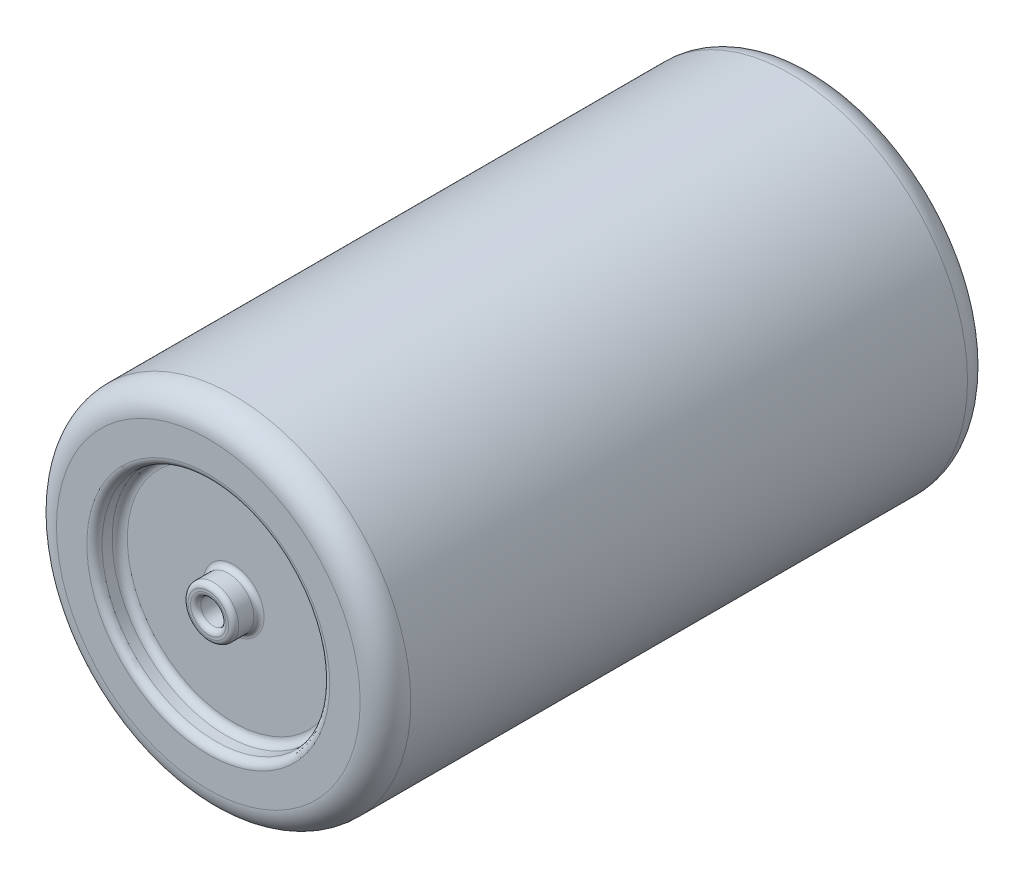
ISO-10303-21;
HEADER;
FILE_DESCRIPTION(('STEP AP214'),'2;1');
FILE_NAME('part.step','',(''),(''),'','','');
FILE_SCHEMA(('AUTOMOTIVE_DESIGN { 1 0 10303 214 1 1 1 1 }'));
ENDSEC;
DATA;
#1=APPLICATION_CONTEXT('core data for automotive mechanical design processes');
#2=APPLICATION_PROTOCOL_DEFINITION('international standard','automotive_design',2000,#1);
#3=PRODUCT_CONTEXT('',#1,'mechanical');
#4=PRODUCT('Part','Part','',(#3));
#5=PRODUCT_RELATED_PRODUCT_CATEGORY('part','',(#4));
#6=PRODUCT_DEFINITION_FORMATION('','',#4);
#7=PRODUCT_DEFINITION_CONTEXT('part definition',#1,'design');
#8=PRODUCT_DEFINITION('design','',#6,#7);
#9=PRODUCT_DEFINITION_SHAPE('','',#8);
#10=(LENGTH_UNIT() NAMED_UNIT(*) SI_UNIT(.MILLI.,.METRE.));
#11=(NAMED_UNIT(*) PLANE_ANGLE_UNIT() SI_UNIT($,.RADIAN.));
#12=(NAMED_UNIT(*) SI_UNIT($,.STERADIAN.) SOLID_ANGLE_UNIT());
#13=UNCERTAINTY_MEASURE_WITH_UNIT(LENGTH_MEASURE(1.E-05),#10,'distance_accuracy_value','');
#14=(GEOMETRIC_REPRESENTATION_CONTEXT(3) GLOBAL_UNCERTAINTY_ASSIGNED_CONTEXT((#13)) GLOBAL_UNIT_ASSIGNED_CONTEXT((#10,
#11,#12)) REPRESENTATION_CONTEXT('',''));
#15=CARTESIAN_POINT('',(0.,0.,0.));
#16=DIRECTION('',(0.,0.,1.));
#17=DIRECTION('',(1.,0.,0.));
#18=AXIS2_PLACEMENT_3D('',#15,#16,#17);
#19=CARTESIAN_POINT('',(0.,0.,6.));
#20=DIRECTION('',(0.,0.,-1.));
#21=DIRECTION('',(-1.,0.,0.));
#22=AXIS2_PLACEMENT_3D('',#19,#20,#21);
#23=CYLINDRICAL_SURFACE('',#22,3.5);
#24=CARTESIAN_POINT('',(0.,0.,-5.5));
#25=DIRECTION('',(0.,0.,1.));
#26=DIRECTION('',(1.,0.,0.));
#27=AXIS2_PLACEMENT_3D('',#24,#25,#26);
#28=CIRCLE('',#27,3.5);
#29=CARTESIAN_POINT('',(3.5,0.,-5.5));
#30=VERTEX_POINT('',#29);
#31=EDGE_CURVE('E121',#30,#30,#28,.T.);
#32=ORIENTED_EDGE('',*,*,#31,.T.);
#33=EDGE_LOOP('',(#32));
#34=FACE_BOUND('',#33,.T.);
#35=CARTESIAN_POINT('',(0.,0.,5.5));
#36=DIRECTION('',(0.,0.,1.));
#37=DIRECTION('',(1.,0.,0.));
#38=AXIS2_PLACEMENT_3D('',#35,#36,#37);
#39=CIRCLE('',#38,3.5);
#40=CARTESIAN_POINT('',(3.5,0.,5.5));
#41=VERTEX_POINT('',#40);
#42=EDGE_CURVE('E124',#41,#41,#39,.F.);
#43=ORIENTED_EDGE('',*,*,#42,.T.);
#44=EDGE_LOOP('',(#43));
#45=FACE_BOUND('',#44,.T.);
#46=ADVANCED_FACE('F35',(#34,#45),#23,.T.);
#47=CARTESIAN_POINT('',(0.,0.,6.));
#48=DIRECTION('',(0.,0.,1.));
#49=DIRECTION('',(1.,0.,0.));
#50=AXIS2_PLACEMENT_3D('',#47,#48,#49);
#51=PLANE('',#50);
#52=CARTESIAN_POINT('',(0.,0.,6.));
#53=DIRECTION('',(0.,0.,1.));
#54=DIRECTION('',(1.,0.,0.));
#55=AXIS2_PLACEMENT_3D('',#52,#53,#54);
#56=CIRCLE('',#55,2.4);
#57=CARTESIAN_POINT('',(2.4,0.,6.));
#58=VERTEX_POINT('',#57);
#59=EDGE_CURVE('E109',#58,#58,#56,.F.);
#60=ORIENTED_EDGE('',*,*,#59,.T.);
#61=EDGE_LOOP('',(#60));
#62=FACE_BOUND('',#61,.T.);
#63=CARTESIAN_POINT('',(0.,0.,6.));
#64=DIRECTION('',(0.,0.,1.));
#65=DIRECTION('',(1.,0.,0.));
#66=AXIS2_PLACEMENT_3D('',#63,#64,#65);
#67=CIRCLE('',#66,3.);
#68=CARTESIAN_POINT('',(3.,0.,6.));
#69=VERTEX_POINT('',#68);
#70=EDGE_CURVE('E115',#69,#69,#67,.T.);
#71=ORIENTED_EDGE('',*,*,#70,.T.);
#72=EDGE_LOOP('',(#71));
#73=FACE_BOUND('',#72,.T.);
#74=ADVANCED_FACE('F137',(#62,#73),#51,.T.);
#75=CARTESIAN_POINT('',(0.,0.,-6.));
#76=DIRECTION('',(0.,0.,1.));
#77=DIRECTION('',(1.,0.,0.));
#78=AXIS2_PLACEMENT_3D('',#75,#76,#77);
#79=PLANE('',#78);
#80=CARTESIAN_POINT('',(0.,0.,-6.));
#81=DIRECTION('',(0.,0.,1.));
#82=DIRECTION('',(1.,0.,0.));
#83=AXIS2_PLACEMENT_3D('',#80,#81,#82);
#84=CIRCLE('',#83,2.4);
#85=CARTESIAN_POINT('',(2.4,0.,-6.));
#86=VERTEX_POINT('',#85);
#87=EDGE_CURVE('E42',#86,#86,#84,.T.);
#88=ORIENTED_EDGE('',*,*,#87,.T.);
#89=EDGE_LOOP('',(#88));
#90=FACE_BOUND('',#89,.T.);
#91=CARTESIAN_POINT('',(0.,0.,-6.));
#92=DIRECTION('',(0.,0.,1.));
#93=DIRECTION('',(1.,0.,0.));
#94=AXIS2_PLACEMENT_3D('',#91,#92,#93);
#95=CIRCLE('',#94,3.);
#96=CARTESIAN_POINT('',(3.,0.,-6.));
#97=VERTEX_POINT('',#96);
#98=EDGE_CURVE('E118',#97,#97,#95,.F.);
#99=ORIENTED_EDGE('',*,*,#98,.T.);
#100=EDGE_LOOP('',(#99));
#101=FACE_BOUND('',#100,.T.);
#102=ADVANCED_FACE('F139',(#90,#101),#79,.F.);
#103=CARTESIAN_POINT('',(0.,0.,-5.5));
#104=DIRECTION('',(0.,0.,1.));
#105=DIRECTION('',(1.,0.,0.));
#106=AXIS2_PLACEMENT_3D('',#103,#104,#105);
#107=TOROIDAL_SURFACE('',#106,3.,0.5);
#108=ORIENTED_EDGE('',*,*,#98,.F.);
#109=EDGE_LOOP('',(#108));
#110=FACE_BOUND('',#109,.T.);
#111=ORIENTED_EDGE('',*,*,#31,.F.);
#112=EDGE_LOOP('',(#111));
#113=FACE_BOUND('',#112,.T.);
#114=ADVANCED_FACE('F133',(#110,#113),#107,.T.);
#115=CARTESIAN_POINT('',(0.,0.,5.5));
#116=DIRECTION('',(0.,0.,1.));
#117=DIRECTION('',(1.,0.,0.));
#118=AXIS2_PLACEMENT_3D('',#115,#116,#117);
#119=TOROIDAL_SURFACE('',#118,3.,0.5);
#120=ORIENTED_EDGE('',*,*,#42,.F.);
#121=EDGE_LOOP('',(#120));
#122=FACE_BOUND('',#121,.T.);
#123=ORIENTED_EDGE('',*,*,#70,.F.);
#124=EDGE_LOOP('',(#123));
#125=FACE_BOUND('',#124,.T.);
#126=ADVANCED_FACE('F129',(#122,#125),#119,.T.);
#127=CARTESIAN_POINT('',(0.,0.,5.5));
#128=DIRECTION('',(0.,0.,1.));
#129=DIRECTION('',(1.,0.,0.));
#130=AXIS2_PLACEMENT_3D('',#127,#128,#129);
#131=CYLINDRICAL_SURFACE('',#130,2.25);
#132=CARTESIAN_POINT('',(0.,0.,5.65));
#133=DIRECTION('',(0.,0.,1.));
#134=DIRECTION('',(1.,0.,0.));
#135=AXIS2_PLACEMENT_3D('',#132,#133,#134);
#136=CIRCLE('',#135,2.25);
#137=CARTESIAN_POINT('',(2.25,0.,5.65));
#138=VERTEX_POINT('',#137);
#139=EDGE_CURVE('E103',#138,#138,#136,.F.);
#140=ORIENTED_EDGE('',*,*,#139,.T.);
#141=EDGE_LOOP('',(#140));
#142=FACE_BOUND('',#141,.T.);
#143=CARTESIAN_POINT('',(0.,0.,5.85));
#144=DIRECTION('',(0.,0.,1.));
#145=DIRECTION('',(1.,0.,0.));
#146=AXIS2_PLACEMENT_3D('',#143,#144,#145);
#147=CIRCLE('',#146,2.25);
#148=CARTESIAN_POINT('',(2.25,0.,5.85));
#149=VERTEX_POINT('',#148);
#150=EDGE_CURVE('E112',#149,#149,#147,.T.);
#151=ORIENTED_EDGE('',*,*,#150,.T.);
#152=EDGE_LOOP('',(#151));
#153=FACE_BOUND('',#152,.T.);
#154=ADVANCED_FACE('F132',(#142,#153),#131,.F.);
#155=CARTESIAN_POINT('',(0.,0.,5.85));
#156=DIRECTION('',(0.,0.,1.));
#157=DIRECTION('',(1.,0.,0.));
#158=AXIS2_PLACEMENT_3D('',#155,#156,#157);
#159=TOROIDAL_SURFACE('',#158,2.4,0.15);
#160=ORIENTED_EDGE('',*,*,#59,.F.);
#161=EDGE_LOOP('',(#160));
#162=FACE_BOUND('',#161,.T.);
#163=ORIENTED_EDGE('',*,*,#150,.F.);
#164=EDGE_LOOP('',(#163));
#165=FACE_BOUND('',#164,.T.);
#166=ADVANCED_FACE('F155',(#162,#165),#159,.T.);
#167=CARTESIAN_POINT('',(0.,0.,-5.5));
#168=DIRECTION('',(0.,0.,-1.));
#169=DIRECTION('',(-1.,0.,0.));
#170=AXIS2_PLACEMENT_3D('',#167,#168,#169);
#171=CYLINDRICAL_SURFACE('',#170,2.25);
#172=CARTESIAN_POINT('',(0.,0.,-5.85));
#173=DIRECTION('',(0.,0.,1.));
#174=DIRECTION('',(1.,0.,0.));
#175=AXIS2_PLACEMENT_3D('',#172,#173,#174);
#176=CIRCLE('',#175,2.25);
#177=CARTESIAN_POINT('',(2.25,0.,-5.85));
#178=VERTEX_POINT('',#177);
#179=EDGE_CURVE('E10',#178,#178,#176,.F.);
#180=ORIENTED_EDGE('',*,*,#179,.T.);
#181=EDGE_LOOP('',(#180));
#182=FACE_BOUND('',#181,.T.);
#183=CARTESIAN_POINT('',(0.,0.,-5.65));
#184=DIRECTION('',(0.,0.,-1.));
#185=DIRECTION('',(-1.,0.,0.));
#186=AXIS2_PLACEMENT_3D('',#183,#184,#185);
#187=CIRCLE('',#186,2.25);
#188=CARTESIAN_POINT('',(-2.25,0.,-5.65));
#189=VERTEX_POINT('',#188);
#190=EDGE_CURVE('E76',#189,#189,#187,.F.);
#191=ORIENTED_EDGE('',*,*,#190,.T.);
#192=EDGE_LOOP('',(#191));
#193=FACE_BOUND('',#192,.T.);
#194=ADVANCED_FACE('F158',(#182,#193),#171,.F.);
#195=CARTESIAN_POINT('',(0.,0.,5.5));
#196=DIRECTION('',(0.,0.,1.));
#197=DIRECTION('',(1.,0.,0.));
#198=AXIS2_PLACEMENT_3D('',#195,#196,#197);
#199=PLANE('',#198);
#200=CARTESIAN_POINT('',(0.,0.,5.5));
#201=DIRECTION('',(0.,0.,1.));
#202=DIRECTION('',(1.,0.,0.));
#203=AXIS2_PLACEMENT_3D('',#200,#201,#202);
#204=CIRCLE('',#203,0.6);
#205=CARTESIAN_POINT('',(0.6,0.,5.5));
#206=VERTEX_POINT('',#205);
#207=EDGE_CURVE('E94',#206,#206,#204,.F.);
#208=ORIENTED_EDGE('',*,*,#207,.T.);
#209=EDGE_LOOP('',(#208));
#210=FACE_BOUND('',#209,.T.);
#211=CARTESIAN_POINT('',(0.,0.,5.5));
#212=DIRECTION('',(0.,0.,1.));
#213=DIRECTION('',(1.,0.,0.));
#214=AXIS2_PLACEMENT_3D('',#211,#212,#213);
#215=CIRCLE('',#214,2.1);
#216=CARTESIAN_POINT('',(2.1,0.,5.5));
#217=VERTEX_POINT('',#216);
#218=EDGE_CURVE('E106',#217,#217,#215,.T.);
#219=ORIENTED_EDGE('',*,*,#218,.T.);
#220=EDGE_LOOP('',(#219));
#221=FACE_BOUND('',#220,.T.);
#222=ADVANCED_FACE('F239',(#210,#221),#199,.T.);
#223=CARTESIAN_POINT('',(0.,0.,6.));
#224=DIRECTION('',(0.,0.,-1.));
#225=DIRECTION('',(-1.,0.,0.));
#226=AXIS2_PLACEMENT_3D('',#223,#224,#225);
#227=CYLINDRICAL_SURFACE('',#226,0.5);
#228=CARTESIAN_POINT('',(0.,0.,5.6));
#229=DIRECTION('',(0.,0.,1.));
#230=DIRECTION('',(1.,0.,0.));
#231=AXIS2_PLACEMENT_3D('',#228,#229,#230);
#232=CIRCLE('',#231,0.5);
#233=CARTESIAN_POINT('',(0.5,0.,5.6));
#234=VERTEX_POINT('',#233);
#235=EDGE_CURVE('E97',#234,#234,#232,.T.);
#236=ORIENTED_EDGE('',*,*,#235,.T.);
#237=EDGE_LOOP('',(#236));
#238=FACE_BOUND('',#237,.T.);
#239=CARTESIAN_POINT('',(0.,0.,5.9));
#240=DIRECTION('',(0.,0.,1.));
#241=DIRECTION('',(1.,0.,0.));
#242=AXIS2_PLACEMENT_3D('',#239,#240,#241);
#243=CIRCLE('',#242,0.5);
#244=CARTESIAN_POINT('',(0.5,0.,5.9));
#245=VERTEX_POINT('',#244);
#246=EDGE_CURVE('E100',#245,#245,#243,.F.);
#247=ORIENTED_EDGE('',*,*,#246,.T.);
#248=EDGE_LOOP('',(#247));
#249=FACE_BOUND('',#248,.T.);
#250=ADVANCED_FACE('F235',(#238,#249),#227,.T.);
#251=CARTESIAN_POINT('',(0.,0.,6.));
#252=DIRECTION('',(0.,0.,1.));
#253=DIRECTION('',(1.,0.,0.));
#254=AXIS2_PLACEMENT_3D('',#251,#252,#253);
#255=PLANE('',#254);
#256=CARTESIAN_POINT('',(0.,0.,6.));
#257=DIRECTION('',(0.,0.,1.));
#258=DIRECTION('',(1.,0.,0.));
#259=AXIS2_PLACEMENT_3D('',#256,#257,#258);
#260=CIRCLE('',#259,0.4);
#261=CARTESIAN_POINT('',(0.4,0.,6.));
#262=VERTEX_POINT('',#261);
#263=EDGE_CURVE('E88',#262,#262,#260,.T.);
#264=ORIENTED_EDGE('',*,*,#263,.T.);
#265=EDGE_LOOP('',(#264));
#266=FACE_BOUND('',#265,.T.);
#267=CARTESIAN_POINT('',(0.,0.,6.));
#268=DIRECTION('',(0.,0.,1.));
#269=DIRECTION('',(1.,0.,0.));
#270=AXIS2_PLACEMENT_3D('',#267,#268,#269);
#271=CIRCLE('',#270,0.35);
#272=CARTESIAN_POINT('',(0.35,0.,6.));
#273=VERTEX_POINT('',#272);
#274=EDGE_CURVE('E91',#273,#273,#271,.F.);
#275=ORIENTED_EDGE('',*,*,#274,.T.);
#276=EDGE_LOOP('',(#275));
#277=FACE_BOUND('',#276,.T.);
#278=ADVANCED_FACE('F231',(#266,#277),#255,.T.);
#279=CARTESIAN_POINT('',(0.,0.,5.5));
#280=DIRECTION('',(0.,0.,1.));
#281=DIRECTION('',(1.,0.,0.));
#282=AXIS2_PLACEMENT_3D('',#279,#280,#281);
#283=CYLINDRICAL_SURFACE('',#282,0.25);
#284=CARTESIAN_POINT('',(0.,0.,5.6));
#285=DIRECTION('',(0.,0.,1.));
#286=DIRECTION('',(1.,0.,0.));
#287=AXIS2_PLACEMENT_3D('',#284,#285,#286);
#288=CIRCLE('',#287,0.25);
#289=CARTESIAN_POINT('',(0.25,0.,5.6));
#290=VERTEX_POINT('',#289);
#291=EDGE_CURVE('E79',#290,#290,#288,.F.);
#292=ORIENTED_EDGE('',*,*,#291,.T.);
#293=EDGE_LOOP('',(#292));
#294=FACE_BOUND('',#293,.T.);
#295=CARTESIAN_POINT('',(0.,0.,5.9));
#296=DIRECTION('',(0.,0.,1.));
#297=DIRECTION('',(1.,0.,0.));
#298=AXIS2_PLACEMENT_3D('',#295,#296,#297);
#299=CIRCLE('',#298,0.25);
#300=CARTESIAN_POINT('',(0.25,0.,5.9));
#301=VERTEX_POINT('',#300);
#302=EDGE_CURVE('E82',#301,#301,#299,.T.);
#303=ORIENTED_EDGE('',*,*,#302,.T.);
#304=EDGE_LOOP('',(#303));
#305=FACE_BOUND('',#304,.T.);
#306=ADVANCED_FACE('F227',(#294,#305),#283,.F.);
#307=CARTESIAN_POINT('',(0.,0.,5.5));
#308=DIRECTION('',(0.,0.,1.));
#309=DIRECTION('',(1.,0.,0.));
#310=AXIS2_PLACEMENT_3D('',#307,#308,#309);
#311=PLANE('',#310);
#312=CARTESIAN_POINT('',(0.,0.,5.5));
#313=DIRECTION('',(0.,0.,1.));
#314=DIRECTION('',(1.,0.,0.));
#315=AXIS2_PLACEMENT_3D('',#312,#313,#314);
#316=CIRCLE('',#315,0.15);
#317=CARTESIAN_POINT('',(0.15,0.,5.5));
#318=VERTEX_POINT('',#317);
#319=EDGE_CURVE('E85',#318,#318,#316,.T.);
#320=ORIENTED_EDGE('',*,*,#319,.T.);
#321=EDGE_LOOP('',(#320));
#322=FACE_BOUND('',#321,.T.);
#323=ADVANCED_FACE('F164',(#322),#311,.T.);
#324=CARTESIAN_POINT('',(0.,0.,5.65));
#325=DIRECTION('',(0.,0.,1.));
#326=DIRECTION('',(1.,0.,0.));
#327=AXIS2_PLACEMENT_3D('',#324,#325,#326);
#328=TOROIDAL_SURFACE('',#327,2.1,0.15);
#329=ORIENTED_EDGE('',*,*,#139,.F.);
#330=EDGE_LOOP('',(#329));
#331=FACE_BOUND('',#330,.T.);
#332=ORIENTED_EDGE('',*,*,#218,.F.);
#333=EDGE_LOOP('',(#332));
#334=FACE_BOUND('',#333,.T.);
#335=ADVANCED_FACE('F160',(#331,#334),#328,.F.);
#336=CARTESIAN_POINT('',(0.,0.,5.6));
#337=DIRECTION('',(0.,0.,1.));
#338=DIRECTION('',(1.,0.,0.));
#339=AXIS2_PLACEMENT_3D('',#336,#337,#338);
#340=TOROIDAL_SURFACE('',#339,0.6,0.1);
#341=ORIENTED_EDGE('',*,*,#207,.F.);
#342=EDGE_LOOP('',(#341));
#343=FACE_BOUND('',#342,.T.);
#344=ORIENTED_EDGE('',*,*,#235,.F.);
#345=EDGE_LOOP('',(#344));
#346=FACE_BOUND('',#345,.T.);
#347=ADVANCED_FACE('F163',(#343,#346),#340,.F.);
#348=CARTESIAN_POINT('',(0.,0.,5.9));
#349=DIRECTION('',(0.,0.,1.));
#350=DIRECTION('',(1.,0.,0.));
#351=AXIS2_PLACEMENT_3D('',#348,#349,#350);
#352=TOROIDAL_SURFACE('',#351,0.4,0.1);
#353=ORIENTED_EDGE('',*,*,#246,.F.);
#354=EDGE_LOOP('',(#353));
#355=FACE_BOUND('',#354,.T.);
#356=ORIENTED_EDGE('',*,*,#263,.F.);
#357=EDGE_LOOP('',(#356));
#358=FACE_BOUND('',#357,.T.);
#359=ADVANCED_FACE('F168',(#355,#358),#352,.T.);
#360=CARTESIAN_POINT('',(0.,0.,5.6));
#361=DIRECTION('',(0.,0.,1.));
#362=DIRECTION('',(1.,0.,0.));
#363=AXIS2_PLACEMENT_3D('',#360,#361,#362);
#364=TOROIDAL_SURFACE('',#363,0.15,0.1);
#365=ORIENTED_EDGE('',*,*,#291,.F.);
#366=EDGE_LOOP('',(#365));
#367=FACE_BOUND('',#366,.T.);
#368=ORIENTED_EDGE('',*,*,#319,.F.);
#369=EDGE_LOOP('',(#368));
#370=FACE_BOUND('',#369,.T.);
#371=ADVANCED_FACE('F172',(#367,#370),#364,.F.);
#372=CARTESIAN_POINT('',(0.,0.,5.9));
#373=DIRECTION('',(0.,0.,1.));
#374=DIRECTION('',(1.,0.,0.));
#375=AXIS2_PLACEMENT_3D('',#372,#373,#374);
#376=TOROIDAL_SURFACE('',#375,0.35,0.1);
#377=ORIENTED_EDGE('',*,*,#274,.F.);
#378=EDGE_LOOP('',(#377));
#379=FACE_BOUND('',#378,.T.);
#380=ORIENTED_EDGE('',*,*,#302,.F.);
#381=EDGE_LOOP('',(#380));
#382=FACE_BOUND('',#381,.T.);
#383=ADVANCED_FACE('F176',(#379,#382),#376,.T.);
#384=CARTESIAN_POINT('',(0.,0.,-5.5));
#385=DIRECTION('',(0.,0.,-1.));
#386=DIRECTION('',(1.,0.,0.));
#387=AXIS2_PLACEMENT_3D('',#384,#385,#386);
#388=PLANE('',#387);
#389=CARTESIAN_POINT('',(0.,0.,-5.5));
#390=DIRECTION('',(0.,0.,-1.));
#391=DIRECTION('',(-1.,0.,0.));
#392=AXIS2_PLACEMENT_3D('',#389,#390,#391);
#393=CIRCLE('',#392,0.6);
#394=CARTESIAN_POINT('',(-0.6,0.,-5.5));
#395=VERTEX_POINT('',#394);
#396=EDGE_CURVE('E64',#395,#395,#393,.F.);
#397=ORIENTED_EDGE('',*,*,#396,.T.);
#398=EDGE_LOOP('',(#397));
#399=FACE_BOUND('',#398,.T.);
#400=CARTESIAN_POINT('',(0.,0.,-5.5));
#401=DIRECTION('',(0.,0.,-1.));
#402=DIRECTION('',(-1.,0.,0.));
#403=AXIS2_PLACEMENT_3D('',#400,#401,#402);
#404=CIRCLE('',#403,2.1);
#405=CARTESIAN_POINT('',(-2.1,0.,-5.5));
#406=VERTEX_POINT('',#405);
#407=EDGE_CURVE('E73',#406,#406,#404,.T.);
#408=ORIENTED_EDGE('',*,*,#407,.T.);
#409=EDGE_LOOP('',(#408));
#410=FACE_BOUND('',#409,.T.);
#411=ADVANCED_FACE('F180',(#399,#410),#388,.T.);
#412=CARTESIAN_POINT('',(0.,0.,-6.));
#413=DIRECTION('',(0.,0.,1.));
#414=DIRECTION('',(1.,0.,0.));
#415=AXIS2_PLACEMENT_3D('',#412,#413,#414);
#416=CYLINDRICAL_SURFACE('',#415,0.5);
#417=CARTESIAN_POINT('',(0.,0.,-5.6));
#418=DIRECTION('',(0.,0.,-1.));
#419=DIRECTION('',(-1.,0.,0.));
#420=AXIS2_PLACEMENT_3D('',#417,#418,#419);
#421=CIRCLE('',#420,0.5);
#422=CARTESIAN_POINT('',(-0.5,0.,-5.6));
#423=VERTEX_POINT('',#422);
#424=EDGE_CURVE('E67',#423,#423,#421,.T.);
#425=ORIENTED_EDGE('',*,*,#424,.T.);
#426=EDGE_LOOP('',(#425));
#427=FACE_BOUND('',#426,.T.);
#428=CARTESIAN_POINT('',(0.,0.,-5.9));
#429=DIRECTION('',(0.,0.,-1.));
#430=DIRECTION('',(-1.,0.,0.));
#431=AXIS2_PLACEMENT_3D('',#428,#429,#430);
#432=CIRCLE('',#431,0.5);
#433=CARTESIAN_POINT('',(-0.5,0.,-5.9));
#434=VERTEX_POINT('',#433);
#435=EDGE_CURVE('E70',#434,#434,#432,.F.);
#436=ORIENTED_EDGE('',*,*,#435,.T.);
#437=EDGE_LOOP('',(#436));
#438=FACE_BOUND('',#437,.T.);
#439=ADVANCED_FACE('F212',(#427,#438),#416,.T.);
#440=CARTESIAN_POINT('',(0.,0.,-6.));
#441=DIRECTION('',(0.,0.,-1.));
#442=DIRECTION('',(1.,0.,0.));
#443=AXIS2_PLACEMENT_3D('',#440,#441,#442);
#444=PLANE('',#443);
#445=CARTESIAN_POINT('',(0.,0.,-6.));
#446=DIRECTION('',(0.,0.,-1.));
#447=DIRECTION('',(-1.,0.,0.));
#448=AXIS2_PLACEMENT_3D('',#445,#446,#447);
#449=CIRCLE('',#448,0.4);
#450=CARTESIAN_POINT('',(-0.4,0.,-6.));
#451=VERTEX_POINT('',#450);
#452=EDGE_CURVE('E58',#451,#451,#449,.T.);
#453=ORIENTED_EDGE('',*,*,#452,.T.);
#454=EDGE_LOOP('',(#453));
#455=FACE_BOUND('',#454,.T.);
#456=CARTESIAN_POINT('',(0.,0.,-6.));
#457=DIRECTION('',(0.,0.,-1.));
#458=DIRECTION('',(-1.,0.,0.));
#459=AXIS2_PLACEMENT_3D('',#456,#457,#458);
#460=CIRCLE('',#459,0.35);
#461=CARTESIAN_POINT('',(-0.35,0.,-6.));
#462=VERTEX_POINT('',#461);
#463=EDGE_CURVE('E61',#462,#462,#460,.F.);
#464=ORIENTED_EDGE('',*,*,#463,.T.);
#465=EDGE_LOOP('',(#464));
#466=FACE_BOUND('',#465,.T.);
#467=ADVANCED_FACE('F209',(#455,#466),#444,.T.);
#468=CARTESIAN_POINT('',(0.,0.,-5.5));
#469=DIRECTION('',(0.,0.,-1.));
#470=DIRECTION('',(-1.,0.,0.));
#471=AXIS2_PLACEMENT_3D('',#468,#469,#470);
#472=CYLINDRICAL_SURFACE('',#471,0.25);
#473=CARTESIAN_POINT('',(0.,0.,-5.6));
#474=DIRECTION('',(0.,0.,-1.));
#475=DIRECTION('',(-1.,0.,0.));
#476=AXIS2_PLACEMENT_3D('',#473,#474,#475);
#477=CIRCLE('',#476,0.25);
#478=CARTESIAN_POINT('',(-0.25,0.,-5.6));
#479=VERTEX_POINT('',#478);
#480=EDGE_CURVE('E50',#479,#479,#477,.F.);
#481=ORIENTED_EDGE('',*,*,#480,.T.);
#482=EDGE_LOOP('',(#481));
#483=FACE_BOUND('',#482,.T.);
#484=CARTESIAN_POINT('',(0.,0.,-5.9));
#485=DIRECTION('',(0.,0.,-1.));
#486=DIRECTION('',(-1.,0.,0.));
#487=AXIS2_PLACEMENT_3D('',#484,#485,#486);
#488=CIRCLE('',#487,0.25);
#489=CARTESIAN_POINT('',(-0.25,0.,-5.9));
#490=VERTEX_POINT('',#489);
#491=EDGE_CURVE('E55',#490,#490,#488,.T.);
#492=ORIENTED_EDGE('',*,*,#491,.T.);
#493=EDGE_LOOP('',(#492));
#494=FACE_BOUND('',#493,.T.);
#495=ADVANCED_FACE('F211',(#483,#494),#472,.F.);
#496=CARTESIAN_POINT('',(0.,0.,-5.5));
#497=DIRECTION('',(0.,0.,-1.));
#498=DIRECTION('',(1.,0.,0.));
#499=AXIS2_PLACEMENT_3D('',#496,#497,#498);
#500=PLANE('',#499);
#501=CARTESIAN_POINT('',(0.,0.,-5.5));
#502=DIRECTION('',(0.,0.,-1.));
#503=DIRECTION('',(-1.,0.,0.));
#504=AXIS2_PLACEMENT_3D('',#501,#502,#503);
#505=CIRCLE('',#504,0.15);
#506=CARTESIAN_POINT('',(-0.15,0.,-5.5));
#507=VERTEX_POINT('',#506);
#508=EDGE_CURVE('E46',#507,#507,#505,.T.);
#509=ORIENTED_EDGE('',*,*,#508,.T.);
#510=EDGE_LOOP('',(#509));
#511=FACE_BOUND('',#510,.T.);
#512=ADVANCED_FACE('F186',(#511),#500,.T.);
#513=CARTESIAN_POINT('',(0.,0.,-5.65));
#514=DIRECTION('',(0.,0.,-1.));
#515=DIRECTION('',(-1.,0.,0.));
#516=AXIS2_PLACEMENT_3D('',#513,#514,#515);
#517=TOROIDAL_SURFACE('',#516,2.1,0.15);
#518=ORIENTED_EDGE('',*,*,#407,.F.);
#519=EDGE_LOOP('',(#518));
#520=FACE_BOUND('',#519,.T.);
#521=ORIENTED_EDGE('',*,*,#190,.F.);
#522=EDGE_LOOP('',(#521));
#523=FACE_BOUND('',#522,.T.);
#524=ADVANCED_FACE('F182',(#520,#523),#517,.F.);
#525=CARTESIAN_POINT('',(0.,0.,-5.6));
#526=DIRECTION('',(0.,0.,-1.));
#527=DIRECTION('',(-1.,0.,0.));
#528=AXIS2_PLACEMENT_3D('',#525,#526,#527);
#529=TOROIDAL_SURFACE('',#528,0.6,0.1);
#530=ORIENTED_EDGE('',*,*,#396,.F.);
#531=EDGE_LOOP('',(#530));
#532=FACE_BOUND('',#531,.T.);
#533=ORIENTED_EDGE('',*,*,#424,.F.);
#534=EDGE_LOOP('',(#533));
#535=FACE_BOUND('',#534,.T.);
#536=ADVANCED_FACE('F185',(#532,#535),#529,.F.);
#537=CARTESIAN_POINT('',(0.,0.,-5.9));
#538=DIRECTION('',(0.,0.,-1.));
#539=DIRECTION('',(-1.,0.,0.));
#540=AXIS2_PLACEMENT_3D('',#537,#538,#539);
#541=TOROIDAL_SURFACE('',#540,0.4,0.1);
#542=ORIENTED_EDGE('',*,*,#452,.F.);
#543=EDGE_LOOP('',(#542));
#544=FACE_BOUND('',#543,.T.);
#545=ORIENTED_EDGE('',*,*,#435,.F.);
#546=EDGE_LOOP('',(#545));
#547=FACE_BOUND('',#546,.T.);
#548=ADVANCED_FACE('F190',(#544,#547),#541,.T.);
#549=CARTESIAN_POINT('',(0.,0.,-5.6));
#550=DIRECTION('',(0.,0.,-1.));
#551=DIRECTION('',(-1.,0.,0.));
#552=AXIS2_PLACEMENT_3D('',#549,#550,#551);
#553=TOROIDAL_SURFACE('',#552,0.15,0.1);
#554=ORIENTED_EDGE('',*,*,#508,.F.);
#555=EDGE_LOOP('',(#554));
#556=FACE_BOUND('',#555,.T.);
#557=ORIENTED_EDGE('',*,*,#480,.F.);
#558=EDGE_LOOP('',(#557));
#559=FACE_BOUND('',#558,.T.);
#560=ADVANCED_FACE('F194',(#556,#559),#553,.F.);
#561=CARTESIAN_POINT('',(0.,0.,-5.9));
#562=DIRECTION('',(0.,0.,-1.));
#563=DIRECTION('',(-1.,0.,0.));
#564=AXIS2_PLACEMENT_3D('',#561,#562,#563);
#565=TOROIDAL_SURFACE('',#564,0.35,0.1);
#566=ORIENTED_EDGE('',*,*,#491,.F.);
#567=EDGE_LOOP('',(#566));
#568=FACE_BOUND('',#567,.T.);
#569=ORIENTED_EDGE('',*,*,#463,.F.);
#570=EDGE_LOOP('',(#569));
#571=FACE_BOUND('',#570,.T.);
#572=ADVANCED_FACE('F197',(#568,#571),#565,.T.);
#573=CARTESIAN_POINT('',(0.,0.,-5.85));
#574=DIRECTION('',(0.,0.,1.));
#575=DIRECTION('',(1.,0.,0.));
#576=AXIS2_PLACEMENT_3D('',#573,#574,#575);
#577=TOROIDAL_SURFACE('',#576,2.4,0.15);
#578=ORIENTED_EDGE('',*,*,#179,.F.);
#579=EDGE_LOOP('',(#578));
#580=FACE_BOUND('',#579,.T.);
#581=ORIENTED_EDGE('',*,*,#87,.F.);
#582=EDGE_LOOP('',(#581));
#583=FACE_BOUND('',#582,.T.);
#584=ADVANCED_FACE('F37',(#580,#583),#577,.T.);
#585=CLOSED_SHELL('',(#46,#74,#102,#114,#126,#154,#166,#194,#222,#250,#278,#306,#323,#335,#347,
#359,#371,#383,#411,#439,#467,#495,#512,#524,#536,#548,#560,#572,#584));
#586=MANIFOLD_SOLID_BREP('B2',#585);
#587=ADVANCED_BREP_SHAPE_REPRESENTATION('',(#18,#586),#14);
#588=SHAPE_DEFINITION_REPRESENTATION(#9,#587);
ENDSEC;
END-ISO-10303-21;
